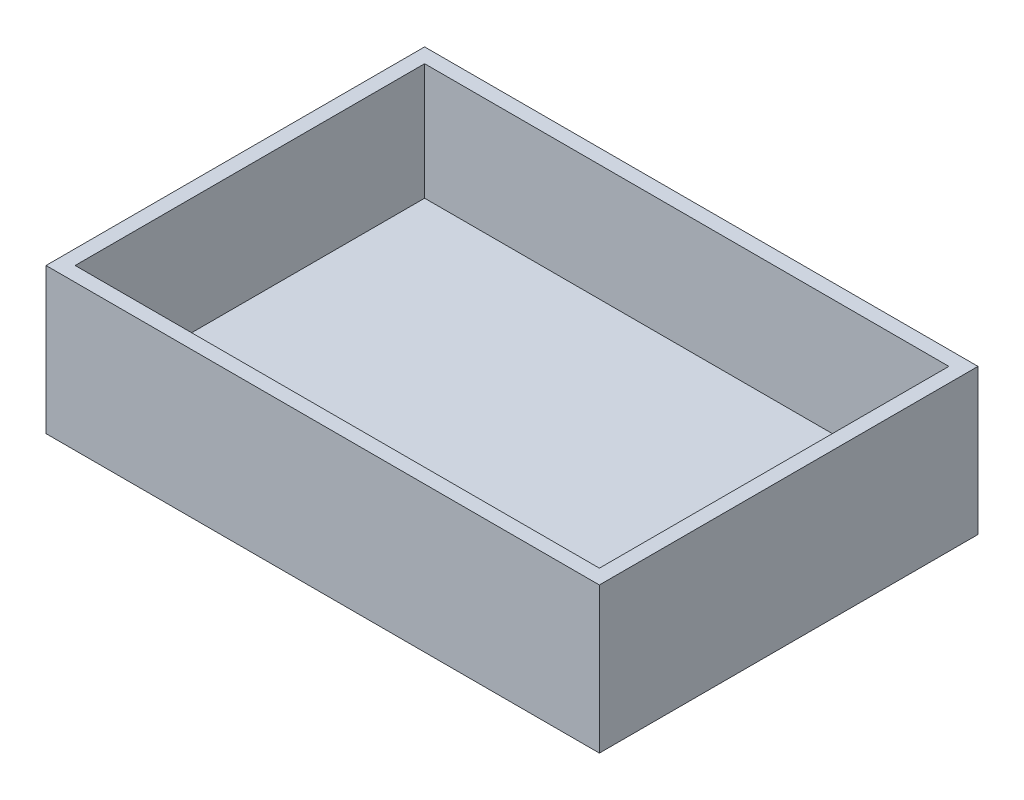
ISO-10303-21;
HEADER;
FILE_DESCRIPTION(('STEP AP214'),'2;1');
FILE_NAME('part.step','',(''),(''),'','','');
FILE_SCHEMA(('AUTOMOTIVE_DESIGN { 1 0 10303 214 1 1 1 1 }'));
ENDSEC;
DATA;
#1=APPLICATION_CONTEXT('core data for automotive mechanical design processes');
#2=APPLICATION_PROTOCOL_DEFINITION('international standard','automotive_design',2000,#1);
#3=PRODUCT_CONTEXT('',#1,'mechanical');
#4=PRODUCT('Part','Part','',(#3));
#5=PRODUCT_RELATED_PRODUCT_CATEGORY('part','',(#4));
#6=PRODUCT_DEFINITION_FORMATION('','',#4);
#7=PRODUCT_DEFINITION_CONTEXT('part definition',#1,'design');
#8=PRODUCT_DEFINITION('design','',#6,#7);
#9=PRODUCT_DEFINITION_SHAPE('','',#8);
#10=(LENGTH_UNIT() NAMED_UNIT(*) SI_UNIT(.MILLI.,.METRE.));
#11=(NAMED_UNIT(*) PLANE_ANGLE_UNIT() SI_UNIT($,.RADIAN.));
#12=(NAMED_UNIT(*) SI_UNIT($,.STERADIAN.) SOLID_ANGLE_UNIT());
#13=UNCERTAINTY_MEASURE_WITH_UNIT(LENGTH_MEASURE(1.E-05),#10,'distance_accuracy_value','');
#14=(GEOMETRIC_REPRESENTATION_CONTEXT(3) GLOBAL_UNCERTAINTY_ASSIGNED_CONTEXT((#13)) GLOBAL_UNIT_ASSIGNED_CONTEXT((#10,
#11,#12)) REPRESENTATION_CONTEXT('',''));
#15=CARTESIAN_POINT('',(0.,0.,0.));
#16=DIRECTION('',(0.,0.,1.));
#17=DIRECTION('',(1.,0.,0.));
#18=AXIS2_PLACEMENT_3D('',#15,#16,#17);
#19=CARTESIAN_POINT('',(15.,10.,15.));
#20=DIRECTION('',(0.,0.,1.));
#21=DIRECTION('',(1.,0.,0.));
#22=AXIS2_PLACEMENT_3D('',#19,#20,#21);
#23=PLANE('',#22);
#24=DIRECTION('',(-1.,0.,0.));
#25=VECTOR('',#24,1.);
#26=CARTESIAN_POINT('',(15.,0.,15.));
#27=LINE('',#26,#25);
#28=CARTESIAN_POINT('',(15.,0.,15.));
#29=VERTEX_POINT('',#28);
#30=CARTESIAN_POINT('',(-175.,0.,15.));
#31=VERTEX_POINT('',#30);
#32=EDGE_CURVE('E113',#29,#31,#27,.T.);
#33=ORIENTED_EDGE('',*,*,#32,.F.);
#34=DIRECTION('',(0.,-1.,0.));
#35=VECTOR('',#34,1.);
#36=CARTESIAN_POINT('',(15.,10.,15.));
#37=LINE('',#36,#35);
#38=CARTESIAN_POINT('',(15.,50.,15.));
#39=VERTEX_POINT('',#38);
#40=EDGE_CURVE('E11',#39,#29,#37,.T.);
#41=ORIENTED_EDGE('',*,*,#40,.F.);
#42=DIRECTION('',(-1.,0.,0.));
#43=VECTOR('',#42,1.);
#44=CARTESIAN_POINT('',(0.,50.,15.));
#45=LINE('',#44,#43);
#46=CARTESIAN_POINT('',(-175.,50.,15.));
#47=VERTEX_POINT('',#46);
#48=EDGE_CURVE('E115',#39,#47,#45,.T.);
#49=ORIENTED_EDGE('',*,*,#48,.T.);
#50=DIRECTION('',(0.,-1.,0.));
#51=VECTOR('',#50,1.);
#52=CARTESIAN_POINT('',(-175.,10.,15.));
#53=LINE('',#52,#51);
#54=EDGE_CURVE('E48',#47,#31,#53,.T.);
#55=ORIENTED_EDGE('',*,*,#54,.T.);
#56=EDGE_LOOP('',(#33,#41,#49,#55));
#57=FACE_BOUND('',#56,.T.);
#58=ADVANCED_FACE('F44',(#57),#23,.T.);
#59=CARTESIAN_POINT('',(15.,10.,15.));
#60=DIRECTION('',(-1.,0.,0.));
#61=DIRECTION('',(0.,0.,1.));
#62=AXIS2_PLACEMENT_3D('',#59,#60,#61);
#63=PLANE('',#62);
#64=DIRECTION('',(0.,0.,-1.));
#65=VECTOR('',#64,1.);
#66=CARTESIAN_POINT('',(15.,0.,15.));
#67=LINE('',#66,#65);
#68=CARTESIAN_POINT('',(15.,0.,-115.));
#69=VERTEX_POINT('',#68);
#70=EDGE_CURVE('E188',#29,#69,#67,.T.);
#71=ORIENTED_EDGE('',*,*,#70,.T.);
#72=DIRECTION('',(0.,-1.,0.));
#73=VECTOR('',#72,1.);
#74=CARTESIAN_POINT('',(15.,10.,-115.));
#75=LINE('',#74,#73);
#76=CARTESIAN_POINT('',(15.,50.,-115.));
#77=VERTEX_POINT('',#76);
#78=EDGE_CURVE('E53',#77,#69,#75,.T.);
#79=ORIENTED_EDGE('',*,*,#78,.F.);
#80=DIRECTION('',(0.,0.,-1.));
#81=VECTOR('',#80,1.);
#82=CARTESIAN_POINT('',(15.,50.,0.));
#83=LINE('',#82,#81);
#84=EDGE_CURVE('E120',#39,#77,#83,.T.);
#85=ORIENTED_EDGE('',*,*,#84,.F.);
#86=ORIENTED_EDGE('',*,*,#40,.T.);
#87=EDGE_LOOP('',(#71,#79,#85,#86));
#88=FACE_BOUND('',#87,.T.);
#89=ADVANCED_FACE('F116',(#88),#63,.F.);
#90=CARTESIAN_POINT('',(15.,10.,-115.));
#91=DIRECTION('',(0.,0.,1.));
#92=DIRECTION('',(1.,0.,0.));
#93=AXIS2_PLACEMENT_3D('',#90,#91,#92);
#94=PLANE('',#93);
#95=DIRECTION('',(-1.,0.,0.));
#96=VECTOR('',#95,1.);
#97=CARTESIAN_POINT('',(15.,0.,-115.));
#98=LINE('',#97,#96);
#99=CARTESIAN_POINT('',(-175.,0.,-115.));
#100=VERTEX_POINT('',#99);
#101=EDGE_CURVE('E184',#69,#100,#98,.T.);
#102=ORIENTED_EDGE('',*,*,#101,.T.);
#103=DIRECTION('',(0.,-1.,0.));
#104=VECTOR('',#103,1.);
#105=CARTESIAN_POINT('',(-175.,10.,-115.));
#106=LINE('',#105,#104);
#107=CARTESIAN_POINT('',(-175.,50.,-115.));
#108=VERTEX_POINT('',#107);
#109=EDGE_CURVE('E194',#108,#100,#106,.T.);
#110=ORIENTED_EDGE('',*,*,#109,.F.);
#111=DIRECTION('',(-1.,0.,0.));
#112=VECTOR('',#111,1.);
#113=CARTESIAN_POINT('',(0.,50.,-115.));
#114=LINE('',#113,#112);
#115=EDGE_CURVE('E125',#77,#108,#114,.T.);
#116=ORIENTED_EDGE('',*,*,#115,.F.);
#117=ORIENTED_EDGE('',*,*,#78,.T.);
#118=EDGE_LOOP('',(#102,#110,#116,#117));
#119=FACE_BOUND('',#118,.T.);
#120=ADVANCED_FACE('F201',(#119),#94,.F.);
#121=CARTESIAN_POINT('',(-175.,10.,15.));
#122=DIRECTION('',(-1.,0.,0.));
#123=DIRECTION('',(0.,0.,1.));
#124=AXIS2_PLACEMENT_3D('',#121,#122,#123);
#125=PLANE('',#124);
#126=DIRECTION('',(0.,0.,-1.));
#127=VECTOR('',#126,1.);
#128=CARTESIAN_POINT('',(-175.,0.,15.));
#129=LINE('',#128,#127);
#130=EDGE_CURVE('E181',#31,#100,#129,.T.);
#131=ORIENTED_EDGE('',*,*,#130,.F.);
#132=ORIENTED_EDGE('',*,*,#54,.F.);
#133=DIRECTION('',(0.,0.,-1.));
#134=VECTOR('',#133,1.);
#135=CARTESIAN_POINT('',(-175.,50.,0.));
#136=LINE('',#135,#134);
#137=EDGE_CURVE('E129',#47,#108,#136,.T.);
#138=ORIENTED_EDGE('',*,*,#137,.T.);
#139=ORIENTED_EDGE('',*,*,#109,.T.);
#140=EDGE_LOOP('',(#131,#132,#138,#139));
#141=FACE_BOUND('',#140,.T.);
#142=ADVANCED_FACE('F196',(#141),#125,.T.);
#143=CARTESIAN_POINT('',(0.,0.,0.));
#144=DIRECTION('',(0.,-1.,0.));
#145=DIRECTION('',(0.,0.,-1.));
#146=AXIS2_PLACEMENT_3D('',#143,#144,#145);
#147=PLANE('',#146);
#148=ORIENTED_EDGE('',*,*,#32,.T.);
#149=ORIENTED_EDGE('',*,*,#130,.T.);
#150=ORIENTED_EDGE('',*,*,#101,.F.);
#151=ORIENTED_EDGE('',*,*,#70,.F.);
#152=EDGE_LOOP('',(#148,#149,#150,#151));
#153=FACE_BOUND('',#152,.T.);
#154=ADVANCED_FACE('F202',(#153),#147,.T.);
#155=CARTESIAN_POINT('',(10.,50.,0.));
#156=DIRECTION('',(-1.,0.,0.));
#157=DIRECTION('',(0.,0.,1.));
#158=AXIS2_PLACEMENT_3D('',#155,#156,#157);
#159=PLANE('',#158);
#160=DIRECTION('',(0.,0.,-1.));
#161=VECTOR('',#160,1.);
#162=CARTESIAN_POINT('',(10.,10.,0.));
#163=LINE('',#162,#161);
#164=CARTESIAN_POINT('',(10.,10.,10.));
#165=VERTEX_POINT('',#164);
#166=CARTESIAN_POINT('',(10.,10.,-110.));
#167=VERTEX_POINT('',#166);
#168=EDGE_CURVE('E172',#165,#167,#163,.T.);
#169=ORIENTED_EDGE('',*,*,#168,.F.);
#170=DIRECTION('',(0.,-1.,0.));
#171=VECTOR('',#170,1.);
#172=CARTESIAN_POINT('',(10.,50.,10.));
#173=LINE('',#172,#171);
#174=CARTESIAN_POINT('',(10.,50.,10.));
#175=VERTEX_POINT('',#174);
#176=EDGE_CURVE('E163',#175,#165,#173,.T.);
#177=ORIENTED_EDGE('',*,*,#176,.F.);
#178=DIRECTION('',(0.,0.,-1.));
#179=VECTOR('',#178,1.);
#180=CARTESIAN_POINT('',(10.,50.,0.));
#181=LINE('',#180,#179);
#182=CARTESIAN_POINT('',(10.,50.,-110.));
#183=VERTEX_POINT('',#182);
#184=EDGE_CURVE('E140',#175,#183,#181,.T.);
#185=ORIENTED_EDGE('',*,*,#184,.T.);
#186=DIRECTION('',(0.,-1.,0.));
#187=VECTOR('',#186,1.);
#188=CARTESIAN_POINT('',(10.,50.,-110.));
#189=LINE('',#188,#187);
#190=EDGE_CURVE('E153',#183,#167,#189,.T.);
#191=ORIENTED_EDGE('',*,*,#190,.T.);
#192=EDGE_LOOP('',(#169,#177,#185,#191));
#193=FACE_BOUND('',#192,.T.);
#194=ADVANCED_FACE('F241',(#193),#159,.T.);
#195=CARTESIAN_POINT('',(0.,50.,10.));
#196=DIRECTION('',(0.,0.,1.));
#197=DIRECTION('',(1.,0.,0.));
#198=AXIS2_PLACEMENT_3D('',#195,#196,#197);
#199=PLANE('',#198);
#200=ORIENTED_EDGE('',*,*,#176,.T.);
#201=DIRECTION('',(-1.,0.,0.));
#202=VECTOR('',#201,1.);
#203=CARTESIAN_POINT('',(0.,10.,10.));
#204=LINE('',#203,#202);
#205=CARTESIAN_POINT('',(-170.,10.,10.));
#206=VERTEX_POINT('',#205);
#207=EDGE_CURVE('E175',#165,#206,#204,.T.);
#208=ORIENTED_EDGE('',*,*,#207,.T.);
#209=DIRECTION('',(0.,-1.,0.));
#210=VECTOR('',#209,1.);
#211=CARTESIAN_POINT('',(-170.,50.,10.));
#212=LINE('',#211,#210);
#213=CARTESIAN_POINT('',(-170.,50.,10.));
#214=VERTEX_POINT('',#213);
#215=EDGE_CURVE('E160',#214,#206,#212,.T.);
#216=ORIENTED_EDGE('',*,*,#215,.F.);
#217=DIRECTION('',(-1.,0.,0.));
#218=VECTOR('',#217,1.);
#219=CARTESIAN_POINT('',(0.,50.,10.));
#220=LINE('',#219,#218);
#221=EDGE_CURVE('E141',#175,#214,#220,.T.);
#222=ORIENTED_EDGE('',*,*,#221,.F.);
#223=EDGE_LOOP('',(#200,#208,#216,#222));
#224=FACE_BOUND('',#223,.T.);
#225=ADVANCED_FACE('F249',(#224),#199,.F.);
#226=CARTESIAN_POINT('',(-170.,50.,0.));
#227=DIRECTION('',(-1.,0.,0.));
#228=DIRECTION('',(0.,0.,1.));
#229=AXIS2_PLACEMENT_3D('',#226,#227,#228);
#230=PLANE('',#229);
#231=ORIENTED_EDGE('',*,*,#215,.T.);
#232=DIRECTION('',(0.,0.,-1.));
#233=VECTOR('',#232,1.);
#234=CARTESIAN_POINT('',(-170.,10.,0.));
#235=LINE('',#234,#233);
#236=CARTESIAN_POINT('',(-170.,10.,-110.));
#237=VERTEX_POINT('',#236);
#238=EDGE_CURVE('E170',#206,#237,#235,.T.);
#239=ORIENTED_EDGE('',*,*,#238,.T.);
#240=DIRECTION('',(0.,-1.,0.));
#241=VECTOR('',#240,1.);
#242=CARTESIAN_POINT('',(-170.,50.,-110.));
#243=LINE('',#242,#241);
#244=CARTESIAN_POINT('',(-170.,50.,-110.));
#245=VERTEX_POINT('',#244);
#246=EDGE_CURVE('E65',#245,#237,#243,.T.);
#247=ORIENTED_EDGE('',*,*,#246,.F.);
#248=DIRECTION('',(0.,0.,-1.));
#249=VECTOR('',#248,1.);
#250=CARTESIAN_POINT('',(-170.,50.,0.));
#251=LINE('',#250,#249);
#252=EDGE_CURVE('E144',#214,#245,#251,.T.);
#253=ORIENTED_EDGE('',*,*,#252,.F.);
#254=EDGE_LOOP('',(#231,#239,#247,#253));
#255=FACE_BOUND('',#254,.T.);
#256=ADVANCED_FACE('F259',(#255),#230,.F.);
#257=CARTESIAN_POINT('',(0.,50.,-110.));
#258=DIRECTION('',(0.,0.,1.));
#259=DIRECTION('',(1.,0.,0.));
#260=AXIS2_PLACEMENT_3D('',#257,#258,#259);
#261=PLANE('',#260);
#262=DIRECTION('',(-1.,0.,0.));
#263=VECTOR('',#262,1.);
#264=CARTESIAN_POINT('',(0.,10.,-110.));
#265=LINE('',#264,#263);
#266=EDGE_CURVE('E164',#167,#237,#265,.T.);
#267=ORIENTED_EDGE('',*,*,#266,.F.);
#268=ORIENTED_EDGE('',*,*,#190,.F.);
#269=DIRECTION('',(-1.,0.,0.));
#270=VECTOR('',#269,1.);
#271=CARTESIAN_POINT('',(0.,50.,-110.));
#272=LINE('',#271,#270);
#273=EDGE_CURVE('E149',#183,#245,#272,.T.);
#274=ORIENTED_EDGE('',*,*,#273,.T.);
#275=ORIENTED_EDGE('',*,*,#246,.T.);
#276=EDGE_LOOP('',(#267,#268,#274,#275));
#277=FACE_BOUND('',#276,.T.);
#278=ADVANCED_FACE('F269',(#277),#261,.T.);
#279=CARTESIAN_POINT('',(0.,50.,0.));
#280=DIRECTION('',(0.,1.,0.));
#281=DIRECTION('',(0.,0.,1.));
#282=AXIS2_PLACEMENT_3D('',#279,#280,#281);
#283=PLANE('',#282);
#284=ORIENTED_EDGE('',*,*,#48,.F.);
#285=ORIENTED_EDGE('',*,*,#84,.T.);
#286=ORIENTED_EDGE('',*,*,#115,.T.);
#287=ORIENTED_EDGE('',*,*,#137,.F.);
#288=EDGE_LOOP('',(#284,#285,#286,#287));
#289=FACE_BOUND('',#288,.T.);
#290=ORIENTED_EDGE('',*,*,#184,.F.);
#291=ORIENTED_EDGE('',*,*,#221,.T.);
#292=ORIENTED_EDGE('',*,*,#252,.T.);
#293=ORIENTED_EDGE('',*,*,#273,.F.);
#294=EDGE_LOOP('',(#290,#291,#292,#293));
#295=FACE_BOUND('',#294,.T.);
#296=ADVANCED_FACE('F128',(#289,#295),#283,.T.);
#297=CARTESIAN_POINT('',(0.,10.,0.));
#298=DIRECTION('',(0.,-1.,0.));
#299=DIRECTION('',(0.,0.,-1.));
#300=AXIS2_PLACEMENT_3D('',#297,#298,#299);
#301=PLANE('',#300);
#302=ORIENTED_EDGE('',*,*,#207,.F.);
#303=ORIENTED_EDGE('',*,*,#168,.T.);
#304=ORIENTED_EDGE('',*,*,#266,.T.);
#305=ORIENTED_EDGE('',*,*,#238,.F.);
#306=EDGE_LOOP('',(#302,#303,#304,#305));
#307=FACE_BOUND('',#306,.T.);
#308=ADVANCED_FACE('F290',(#307),#301,.F.);
#309=CLOSED_SHELL('',(#58,#89,#120,#142,#154,#194,#225,#256,#278,#296,#308));
#310=MANIFOLD_SOLID_BREP('B2',#309);
#311=ADVANCED_BREP_SHAPE_REPRESENTATION('',(#18,#310),#14);
#312=SHAPE_DEFINITION_REPRESENTATION(#9,#311);
ENDSEC;
END-ISO-10303-21;
